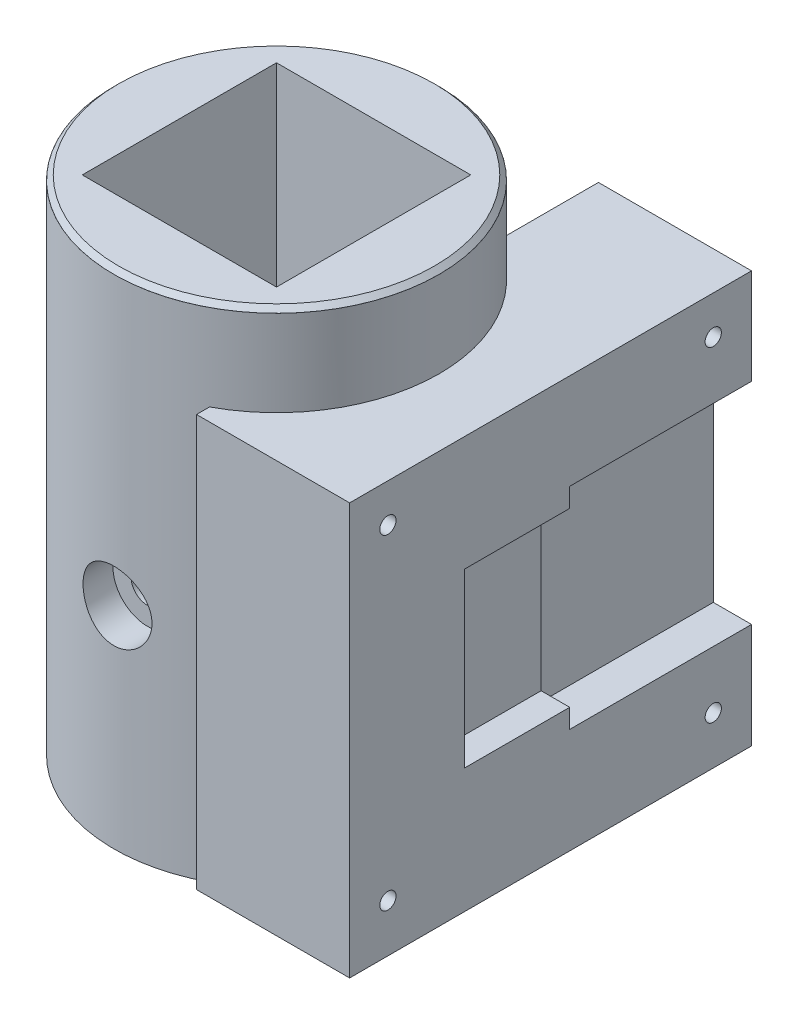
ISO-10303-21;
HEADER;
FILE_DESCRIPTION(('STEP AP214'),'2;1');
FILE_NAME('part.step','',(''),(''),'','','');
FILE_SCHEMA(('AUTOMOTIVE_DESIGN { 1 0 10303 214 1 1 1 1 }'));
ENDSEC;
DATA;
#1=APPLICATION_CONTEXT('core data for automotive mechanical design processes');
#2=APPLICATION_PROTOCOL_DEFINITION('international standard','automotive_design',2000,#1);
#3=PRODUCT_CONTEXT('',#1,'mechanical');
#4=PRODUCT('Part','Part','',(#3));
#5=PRODUCT_RELATED_PRODUCT_CATEGORY('part','',(#4));
#6=PRODUCT_DEFINITION_FORMATION('','',#4);
#7=PRODUCT_DEFINITION_CONTEXT('part definition',#1,'design');
#8=PRODUCT_DEFINITION('design','',#6,#7);
#9=PRODUCT_DEFINITION_SHAPE('','',#8);
#10=(LENGTH_UNIT() NAMED_UNIT(*) SI_UNIT(.MILLI.,.METRE.));
#11=(NAMED_UNIT(*) PLANE_ANGLE_UNIT() SI_UNIT($,.RADIAN.));
#12=(NAMED_UNIT(*) SI_UNIT($,.STERADIAN.) SOLID_ANGLE_UNIT());
#13=UNCERTAINTY_MEASURE_WITH_UNIT(LENGTH_MEASURE(1.E-05),#10,'distance_accuracy_value','');
#14=(GEOMETRIC_REPRESENTATION_CONTEXT(3) GLOBAL_UNCERTAINTY_ASSIGNED_CONTEXT((#13)) GLOBAL_UNIT_ASSIGNED_CONTEXT((#10,
#11,#12)) REPRESENTATION_CONTEXT('',''));
#15=CARTESIAN_POINT('',(0.,0.,0.));
#16=DIRECTION('',(0.,0.,1.));
#17=DIRECTION('',(1.,0.,0.));
#18=AXIS2_PLACEMENT_3D('',#15,#16,#17);
#19=CARTESIAN_POINT('',(0.,-95.,13.5));
#20=DIRECTION('',(0.,0.,1.));
#21=DIRECTION('',(1.,0.,0.));
#22=AXIS2_PLACEMENT_3D('',#19,#20,#21);
#23=PLANE('',#22);
#24=CARTESIAN_POINT('',(0.,-95.,13.5));
#25=DIRECTION('',(0.,0.,-1.));
#26=DIRECTION('',(1.,0.,0.));
#27=AXIS2_PLACEMENT_3D('',#24,#25,#26);
#28=CIRCLE('',#27,1.7);
#29=CARTESIAN_POINT('',(1.7,-95.,13.5));
#30=VERTEX_POINT('',#29);
#31=EDGE_CURVE('E318',#30,#30,#28,.T.);
#32=ORIENTED_EDGE('',*,*,#31,.T.);
#33=EDGE_LOOP('',(#32));
#34=FACE_BOUND('',#33,.T.);
#35=CARTESIAN_POINT('',(0.,-95.,13.5));
#36=DIRECTION('',(0.,0.,-1.));
#37=DIRECTION('',(1.,0.,0.));
#38=AXIS2_PLACEMENT_3D('',#35,#36,#37);
#39=CIRCLE('',#38,3.6);
#40=CARTESIAN_POINT('',(3.6,-95.,13.5));
#41=VERTEX_POINT('',#40);
#42=EDGE_CURVE('E314',#41,#41,#39,.T.);
#43=ORIENTED_EDGE('',*,*,#42,.F.);
#44=EDGE_LOOP('',(#43));
#45=FACE_BOUND('',#44,.T.);
#46=ADVANCED_FACE('F14',(#34,#45),#23,.T.);
#47=CARTESIAN_POINT('',(0.,-64.5,0.));
#48=DIRECTION('',(0.,-1.,0.));
#49=DIRECTION('',(1.,0.,0.));
#50=AXIS2_PLACEMENT_3D('',#47,#48,#49);
#51=CONICAL_SURFACE('',#50,16.5,0.775497496809);
#52=DIRECTION('',(0.700071410925818,-0.714072839144814,0.));
#53=VECTOR('',#52,1.);
#54=CARTESIAN_POINT('',(16.5,-64.5,0.));
#55=LINE('',#54,#53);
#56=CARTESIAN_POINT('',(16.5,-64.5,0.));
#57=VERTEX_POINT('',#56);
#58=CARTESIAN_POINT('',(16.995098039216,-65.005,0.));
#59=VERTEX_POINT('',#58);
#60=EDGE_CURVE('E9',#57,#59,#55,.T.);
#61=ORIENTED_EDGE('',*,*,#60,.F.);
#62=CARTESIAN_POINT('',(0.,-64.5,0.));
#63=DIRECTION('',(0.,1.,0.));
#64=DIRECTION('',(1.,0.,0.));
#65=AXIS2_PLACEMENT_3D('',#62,#63,#64);
#66=CIRCLE('',#65,16.5);
#67=EDGE_CURVE('E425',#57,#57,#66,.T.);
#68=ORIENTED_EDGE('',*,*,#67,.F.);
#69=ORIENTED_EDGE('',*,*,#60,.T.);
#70=CARTESIAN_POINT('',(0.,-65.005,0.));
#71=DIRECTION('',(0.,1.,0.));
#72=DIRECTION('',(1.,0.,0.));
#73=AXIS2_PLACEMENT_3D('',#70,#71,#72);
#74=CIRCLE('',#73,16.995098039216);
#75=EDGE_CURVE('E428',#59,#59,#74,.T.);
#76=ORIENTED_EDGE('',*,*,#75,.T.);
#77=EDGE_LOOP('',(#61,#68,#69,#76));
#78=FACE_BOUND('',#77,.T.);
#79=ADVANCED_FACE('F593',(#78),#51,.T.);
#80=CARTESIAN_POINT('',(18.99,-78.,12.36));
#81=DIRECTION('',(1.,0.,0.));
#82=DIRECTION('',(0.,1.,0.));
#83=AXIS2_PLACEMENT_3D('',#80,#81,#82);
#84=PLANE('',#83);
#85=CARTESIAN_POINT('',(18.99,-78.,12.36));
#86=DIRECTION('',(-1.,0.,0.));
#87=DIRECTION('',(0.,0.,-1.));
#88=AXIS2_PLACEMENT_3D('',#85,#86,#87);
#89=CIRCLE('',#88,0.85);
#90=CARTESIAN_POINT('',(18.99,-78.,11.51));
#91=VERTEX_POINT('',#90);
#92=EDGE_CURVE('E265',#91,#91,#89,.T.);
#93=ORIENTED_EDGE('',*,*,#92,.F.);
#94=EDGE_LOOP('',(#93));
#95=FACE_BOUND('',#94,.T.);
#96=ADVANCED_FACE('F16',(#95),#84,.T.);
#97=CARTESIAN_POINT('',(18.99,-78.,-21.64));
#98=DIRECTION('',(1.,0.,0.));
#99=DIRECTION('',(0.,1.,0.));
#100=AXIS2_PLACEMENT_3D('',#97,#98,#99);
#101=PLANE('',#100);
#102=CARTESIAN_POINT('',(18.99,-78.,-21.64));
#103=DIRECTION('',(-1.,0.,0.));
#104=DIRECTION('',(0.,0.,-1.));
#105=AXIS2_PLACEMENT_3D('',#102,#103,#104);
#106=CIRCLE('',#105,0.85);
#107=CARTESIAN_POINT('',(18.99,-78.,-22.49));
#108=VERTEX_POINT('',#107);
#109=EDGE_CURVE('E261',#108,#108,#106,.T.);
#110=ORIENTED_EDGE('',*,*,#109,.F.);
#111=EDGE_LOOP('',(#110));
#112=FACE_BOUND('',#111,.T.);
#113=ADVANCED_FACE('F592',(#112),#101,.T.);
#114=CARTESIAN_POINT('',(18.99,-112.,12.36));
#115=DIRECTION('',(1.,0.,0.));
#116=DIRECTION('',(0.,1.,0.));
#117=AXIS2_PLACEMENT_3D('',#114,#115,#116);
#118=PLANE('',#117);
#119=CARTESIAN_POINT('',(18.99,-112.,12.36));
#120=DIRECTION('',(-1.,0.,0.));
#121=DIRECTION('',(0.,0.,-1.));
#122=AXIS2_PLACEMENT_3D('',#119,#120,#121);
#123=CIRCLE('',#122,0.85);
#124=CARTESIAN_POINT('',(18.99,-112.,11.51));
#125=VERTEX_POINT('',#124);
#126=EDGE_CURVE('E262',#125,#125,#123,.T.);
#127=ORIENTED_EDGE('',*,*,#126,.F.);
#128=EDGE_LOOP('',(#127));
#129=FACE_BOUND('',#128,.T.);
#130=ADVANCED_FACE('F599',(#129),#118,.T.);
#131=CARTESIAN_POINT('',(18.99,-112.,-21.64));
#132=DIRECTION('',(1.,0.,0.));
#133=DIRECTION('',(0.,1.,0.));
#134=AXIS2_PLACEMENT_3D('',#131,#132,#133);
#135=PLANE('',#134);
#136=CARTESIAN_POINT('',(18.99,-112.,-21.64));
#137=DIRECTION('',(-1.,0.,0.));
#138=DIRECTION('',(0.,0.,-1.));
#139=AXIS2_PLACEMENT_3D('',#136,#137,#138);
#140=CIRCLE('',#139,0.85);
#141=CARTESIAN_POINT('',(18.99,-112.,-22.49));
#142=VERTEX_POINT('',#141);
#143=EDGE_CURVE('E337',#142,#142,#140,.T.);
#144=ORIENTED_EDGE('',*,*,#143,.F.);
#145=EDGE_LOOP('',(#144));
#146=FACE_BOUND('',#145,.T.);
#147=ADVANCED_FACE('F767',(#146),#135,.T.);
#148=CARTESIAN_POINT('',(21.01,-86.,4.36));
#149=DIRECTION('',(1.,0.,0.));
#150=DIRECTION('',(0.,1.,0.));
#151=AXIS2_PLACEMENT_3D('',#148,#149,#150);
#152=PLANE('',#151);
#153=DIRECTION('',(0.,1.,0.));
#154=VECTOR('',#153,1.);
#155=CARTESIAN_POINT('',(21.01,-85.,-6.64));
#156=LINE('',#155,#154);
#157=CARTESIAN_POINT('',(21.01,-104.,-6.64));
#158=VERTEX_POINT('',#157);
#159=CARTESIAN_POINT('',(21.01,-86.,-6.64));
#160=VERTEX_POINT('',#159);
#161=EDGE_CURVE('E386',#158,#160,#156,.T.);
#162=ORIENTED_EDGE('',*,*,#161,.T.);
#163=DIRECTION('',(0.,0.,-1.));
#164=VECTOR('',#163,1.);
#165=CARTESIAN_POINT('',(21.01,-86.,4.36));
#166=LINE('',#165,#164);
#167=CARTESIAN_POINT('',(21.01,-86.,4.36));
#168=VERTEX_POINT('',#167);
#169=EDGE_CURVE('E357',#168,#160,#166,.T.);
#170=ORIENTED_EDGE('',*,*,#169,.F.);
#171=DIRECTION('',(0.,-1.,0.));
#172=VECTOR('',#171,1.);
#173=CARTESIAN_POINT('',(21.01,-86.,4.36));
#174=LINE('',#173,#172);
#175=CARTESIAN_POINT('',(21.01,-104.,4.36));
#176=VERTEX_POINT('',#175);
#177=EDGE_CURVE('E391',#168,#176,#174,.T.);
#178=ORIENTED_EDGE('',*,*,#177,.T.);
#179=DIRECTION('',(0.,0.,-1.));
#180=VECTOR('',#179,1.);
#181=CARTESIAN_POINT('',(21.01,-104.,4.36));
#182=LINE('',#181,#180);
#183=EDGE_CURVE('E402',#176,#158,#182,.T.);
#184=ORIENTED_EDGE('',*,*,#183,.T.);
#185=EDGE_LOOP('',(#162,#170,#178,#184));
#186=FACE_BOUND('',#185,.T.);
#187=ADVANCED_FACE('F612',(#186),#152,.T.);
#188=CARTESIAN_POINT('',(0.,-95.,9.9));
#189=DIRECTION('',(0.,0.,1.));
#190=DIRECTION('',(1.,0.,0.));
#191=AXIS2_PLACEMENT_3D('',#188,#189,#190);
#192=CYLINDRICAL_SURFACE('',#191,1.7);
#193=ORIENTED_EDGE('',*,*,#31,.F.);
#194=DIRECTION('',(0.,0.,1.));
#195=VECTOR('',#194,1.);
#196=CARTESIAN_POINT('',(1.7,-95.,9.9));
#197=LINE('',#196,#195);
#198=CARTESIAN_POINT('',(1.7,-95.,10.15));
#199=VERTEX_POINT('',#198);
#200=EDGE_CURVE('E25',#199,#30,#197,.T.);
#201=ORIENTED_EDGE('',*,*,#200,.F.);
#202=CARTESIAN_POINT('',(0.,-95.,10.15));
#203=DIRECTION('',(0.,0.,-1.));
#204=DIRECTION('',(1.,0.,0.));
#205=AXIS2_PLACEMENT_3D('',#202,#203,#204);
#206=CIRCLE('',#205,1.7);
#207=EDGE_CURVE('E356',#199,#199,#206,.T.);
#208=ORIENTED_EDGE('',*,*,#207,.T.);
#209=ORIENTED_EDGE('',*,*,#200,.T.);
#210=EDGE_LOOP('',(#193,#201,#208,#209));
#211=FACE_BOUND('',#210,.T.);
#212=ADVANCED_FACE('F766',(#211),#192,.F.);
#213=CARTESIAN_POINT('',(0.,-64.5,0.));
#214=DIRECTION('',(0.,-1.,0.));
#215=DIRECTION('',(0.,0.,-1.));
#216=AXIS2_PLACEMENT_3D('',#213,#214,#215);
#217=PLANE('',#216);
#218=DIRECTION('',(1.,0.,0.));
#219=VECTOR('',#218,1.);
#220=CARTESIAN_POINT('',(-5.075,-64.5,10.15));
#221=LINE('',#220,#219);
#222=CARTESIAN_POINT('',(-10.15,-64.5,10.15));
#223=VERTEX_POINT('',#222);
#224=CARTESIAN_POINT('',(10.15,-64.5,10.15));
#225=VERTEX_POINT('',#224);
#226=EDGE_CURVE('E348',#223,#225,#221,.T.);
#227=ORIENTED_EDGE('',*,*,#226,.F.);
#228=DIRECTION('',(0.,0.,-1.));
#229=VECTOR('',#228,1.);
#230=CARTESIAN_POINT('',(-10.15,-64.5,-5.075));
#231=LINE('',#230,#229);
#232=CARTESIAN_POINT('',(-10.15,-64.5,-10.15));
#233=VERTEX_POINT('',#232);
#234=EDGE_CURVE('E283',#223,#233,#231,.T.);
#235=ORIENTED_EDGE('',*,*,#234,.T.);
#236=DIRECTION('',(1.,0.,0.));
#237=VECTOR('',#236,1.);
#238=CARTESIAN_POINT('',(-5.075,-64.5,-10.15));
#239=LINE('',#238,#237);
#240=CARTESIAN_POINT('',(10.15,-64.5,-10.15));
#241=VERTEX_POINT('',#240);
#242=EDGE_CURVE('E305',#233,#241,#239,.T.);
#243=ORIENTED_EDGE('',*,*,#242,.T.);
#244=DIRECTION('',(0.,0.,-1.));
#245=VECTOR('',#244,1.);
#246=CARTESIAN_POINT('',(10.15,-64.5,-5.075));
#247=LINE('',#246,#245);
#248=EDGE_CURVE('E347',#225,#241,#247,.T.);
#249=ORIENTED_EDGE('',*,*,#248,.F.);
#250=EDGE_LOOP('',(#227,#235,#243,#249));
#251=FACE_BOUND('',#250,.T.);
#252=ORIENTED_EDGE('',*,*,#67,.T.);
#253=EDGE_LOOP('',(#252));
#254=FACE_BOUND('',#253,.T.);
#255=ADVANCED_FACE('F815',(#251,#254),#217,.F.);
#256=CARTESIAN_POINT('',(0.,-95.,13.5));
#257=DIRECTION('',(0.,0.,1.));
#258=DIRECTION('',(1.,0.,0.));
#259=AXIS2_PLACEMENT_3D('',#256,#257,#258);
#260=CYLINDRICAL_SURFACE('',#259,3.6);
#261=CARTESIAN_POINT('',(3.6,-95.,16.614451540752));
#262=CARTESIAN_POINT('',(3.6,-95.26777315453,16.614451540752));
#263=CARTESIAN_POINT('',(3.577237685166,-95.53538564906,16.619383858414));
#264=CARTESIAN_POINT('',(3.531758745326,-95.80169837244,16.629237646499));
#265=CARTESIAN_POINT('',(3.46335241105,-96.06551744181,16.643877350871));
#266=CARTESIAN_POINT('',(3.371579484551,-96.3255142693,16.663033406981));
#267=CARTESIAN_POINT('',(3.25580451209,-96.58012023311,16.686277744104));
#268=CARTESIAN_POINT('',(3.115232097871,-96.82739595312,16.712984097339));
#269=CARTESIAN_POINT('',(2.805467130443,-97.26978617391,16.767545420989));
#270=CARTESIAN_POINT('',(2.642342903132,-97.46811824163,16.794828845275));
#271=CARTESIAN_POINT('',(2.459003642037,-97.65783676193,16.823538731738));
#272=CARTESIAN_POINT('',(2.255004505603,-97.83660695542,16.852911026028));
#273=CARTESIAN_POINT('',(2.030072425646,-98.00176641541,16.881994023457));
#274=CARTESIAN_POINT('',(1.784176317768,-98.15027965778,16.909644603203));
#275=CARTESIAN_POINT('',(1.517634577381,-98.27866616825,16.934557005118));
#276=CARTESIAN_POINT('',(1.001694777047,-98.46645289824,16.972023787808));
#277=CARTESIAN_POINT('',(0.758955768616,-98.53463863698,16.986079389493));
#278=CARTESIAN_POINT('',(0.506182533207,-98.58425532436,16.996591502892));
#279=CARTESIAN_POINT('',(0.246908233122,-98.61315608247,17.002814078562));
#280=CARTESIAN_POINT('',(-0.01508473760298,-98.62022233257,17.004325997724));
#281=CARTESIAN_POINT('',(-0.275924309234,-98.60535921806,17.001098135983));
#282=CARTESIAN_POINT('',(-0.531810960402,-98.56950660007,16.993484005896));
#283=CARTESIAN_POINT('',(-1.074764340282,-98.44913673369,16.968571952306));
#284=CARTESIAN_POINT('',(-1.355399593153,-98.35711588245,16.949803388304));
#285=CARTESIAN_POINT('',(-1.619252975594,-98.24206069226,16.926937630625));
#286=CARTESIAN_POINT('',(-1.864993899809,-98.10724924621,16.901185134546));
#287=CARTESIAN_POINT('',(-2.091716181409,-97.95583186984,16.873745067377));
#288=CARTESIAN_POINT('',(-2.298886618723,-97.79086527956,16.845720094212));
#289=CARTESIAN_POINT('',(-2.486322553434,-97.61532909955,16.818058348424));
#290=CARTESIAN_POINT('',(-2.838424769957,-97.23107695742,16.762402338714));
#291=CARTESIAN_POINT('',(-3.000500569843,-97.01926082443,16.734415422552));
#292=CARTESIAN_POINT('',(-3.141161001074,-96.79902346332,16.708426875864));
#293=CARTESIAN_POINT('',(-3.261131996144,-96.57221659196,16.685093540011));
#294=CARTESIAN_POINT('',(-3.361071300027,-96.34031687102,16.664903604312));
#295=CARTESIAN_POINT('',(-3.441519959156,-96.10452499187,16.648210123126));
#296=CARTESIAN_POINT('',(-3.502864230518,-95.86584351219,16.635258505974));
#297=CARTESIAN_POINT('',(-3.592869286086,-95.35539947687,16.61606617806));
#298=CARTESIAN_POINT('',(-3.616652385529,-95.08337312239,16.610832267228));
#299=CARTESIAN_POINT('',(-3.616993046287,-94.81041949712,16.610718360823));
#300=CARTESIAN_POINT('',(-3.593983753542,-94.5378148131,16.615785594507));
#301=CARTESIAN_POINT('',(-3.547492638832,-94.26683467516,16.625955478273));
#302=CARTESIAN_POINT('',(-3.477177646036,-93.99885421986,16.641004330646));
#303=CARTESIAN_POINT('',(-3.38249586508,-93.73546009191,16.660540795794));
#304=CARTESIAN_POINT('',(-3.081149641833,-93.08922103068,16.71947191069));
#305=CARTESIAN_POINT('',(-2.836340785795,-92.70286119051,16.765003428681));
#306=CARTESIAN_POINT('',(-2.522906906532,-92.33511425735,16.818764155577));
#307=CARTESIAN_POINT('',(-2.139159991293,-92.0026874243,16.876555251895));
#308=CARTESIAN_POINT('',(-1.686844680358,-91.72320923094,16.931562084624));
#309=CARTESIAN_POINT('',(-1.171659153328,-91.51557075228,16.975524999097));
#310=CARTESIAN_POINT('',(-0.603366424343,-91.4,17.));
#311=CARTESIAN_POINT('',(0.388638517101,-91.4,17.));
#312=CARTESIAN_POINT('',(0.768110817666,-91.44794859422,16.989845789984));
#313=CARTESIAN_POINT('',(1.131691661206,-91.53989110451,16.970377216285));
#314=CARTESIAN_POINT('',(1.47354520073,-91.67092090007,16.943350354724));
#315=CARTESIAN_POINT('',(1.788823197178,-91.83517736016,16.911163892741));
#316=CARTESIAN_POINT('',(2.073844907245,-92.02584331245,16.876431056992));
#317=CARTESIAN_POINT('',(2.326321069318,-92.23515224477,16.841538213515));
#318=CARTESIAN_POINT('',(2.817967682385,-92.72679885784,16.767079426699));
#319=CARTESIAN_POINT('',(3.046776654847,-93.02222619612,16.727266276983));
#320=CARTESIAN_POINT('',(3.233937363282,-93.33383842525,16.691440195177));
#321=CARTESIAN_POINT('',(3.381425818088,-93.65678212672,16.661343288464));
#322=CARTESIAN_POINT('',(3.49090840415,-93.98744019132,16.63808979743));
#323=CARTESIAN_POINT('',(3.563570229327,-94.32301701756,16.622344948903));
#324=CARTESIAN_POINT('',(3.6,-94.66124763133,16.614451540752));
#325=CARTESIAN_POINT('',(3.6,-95.,16.614451540752));
#326=(BOUNDED_CURVE() B_SPLINE_CURVE(8,(#261,#262,#263,#264,#265,#266,#267,#268,#269,#270,#271,
#272,#273,#274,#275,#276,#277,#278,#279,#280,#281,#282,#283,#284,#285,#286,#287,#288,#289,#290,
#291,#292,#293,#294,#295,#296,#297,#298,#299,#300,#301,#302,#303,#304,#305,#306,#307,#308,#309,
#310,#311,#312,#313,#314,#315,#316,#317,#318,#319,#320,#321,#322,#323,#324,#325),.UNSPECIFIED.,
.T.,.F.) B_SPLINE_CURVE_WITH_KNOTS((9,7,7,7,7,7,7,7,7,9),(0.,0.110248942133,0.20537819821,
0.281643746127,0.37277263103,0.47277713802,0.584839801916,0.754689416079,0.864092424791,1.),
.UNSPECIFIED.) CURVE() GEOMETRIC_REPRESENTATION_ITEM() RATIONAL_B_SPLINE_CURVE((1.,1.,1.,1.,1.,
1.,1.,1.,1.,1.,1.,1.,1.,1.,1.,1.,1.,1.,1.,1.,1.,1.,1.,1.,1.,1.,1.,1.,1.,1.,1.,1.,1.,1.,1.,1.,1.,
1.,1.,1.,1.,1.,1.,1.,1.,1.,1.,1.,1.,1.,1.,1.,1.,1.,1.,1.,1.,1.,1.,1.,1.,1.,1.,1.,1.)) REPRESENTATION_ITEM(''));
#327=CARTESIAN_POINT('',(3.6,-95.,16.614451540752));
#328=VERTEX_POINT('',#327);
#329=EDGE_CURVE('E274',#328,#328,#326,.T.);
#330=ORIENTED_EDGE('',*,*,#329,.F.);
#331=DIRECTION('',(0.,0.,1.));
#332=VECTOR('',#331,1.);
#333=CARTESIAN_POINT('',(3.6,-95.,13.5));
#334=LINE('',#333,#332);
#335=EDGE_CURVE('E311',#41,#328,#334,.T.);
#336=ORIENTED_EDGE('',*,*,#335,.F.);
#337=ORIENTED_EDGE('',*,*,#42,.T.);
#338=ORIENTED_EDGE('',*,*,#335,.T.);
#339=EDGE_LOOP('',(#330,#336,#337,#338));
#340=FACE_BOUND('',#339,.T.);
#341=ADVANCED_FACE('F841',(#340),#260,.F.);
#342=CARTESIAN_POINT('',(0.,-95.,-17.11));
#343=DIRECTION('',(0.,0.,1.));
#344=DIRECTION('',(1.,0.,0.));
#345=AXIS2_PLACEMENT_3D('',#342,#343,#344);
#346=CYLINDRICAL_SURFACE('',#345,1.4);
#347=CARTESIAN_POINT('',(0.,-95.,-10.15));
#348=DIRECTION('',(0.,0.,-1.));
#349=DIRECTION('',(1.,0.,0.));
#350=AXIS2_PLACEMENT_3D('',#347,#348,#349);
#351=CIRCLE('',#350,1.4);
#352=CARTESIAN_POINT('',(1.4,-95.,-10.15));
#353=VERTEX_POINT('',#352);
#354=EDGE_CURVE('E286',#353,#353,#351,.T.);
#355=ORIENTED_EDGE('',*,*,#354,.F.);
#356=DIRECTION('',(0.,0.,1.));
#357=VECTOR('',#356,1.);
#358=CARTESIAN_POINT('',(1.4,-95.,-17.11));
#359=LINE('',#358,#357);
#360=CARTESIAN_POINT('',(1.4,-95.,-16.94225486763));
#361=VERTEX_POINT('',#360);
#362=EDGE_CURVE('E315',#361,#353,#359,.T.);
#363=ORIENTED_EDGE('',*,*,#362,.F.);
#364=CARTESIAN_POINT('',(1.4,-95.,-16.94225486763));
#365=CARTESIAN_POINT('',(1.4,-95.16791128115,-16.94225486763));
#366=CARTESIAN_POINT('',(1.376505536397,-95.33584013108,-16.94419621495));
#367=CARTESIAN_POINT('',(1.329502754113,-95.50151977948,-16.94808066817));
#368=CARTESIAN_POINT('',(1.258419130172,-95.66242535125,-16.95374676344));
#369=CARTESIAN_POINT('',(1.162397673546,-95.81538346864,-16.96085611902));
#370=CARTESIAN_POINT('',(1.040517657906,-95.95617965038,-16.96877498145));
#371=CARTESIAN_POINT('',(0.760974713983,-96.18743768558,-16.98346949617));
#372=CARTESIAN_POINT('',(0.6049811387,-96.28502531644,-16.99047866886));
#373=CARTESIAN_POINT('',(0.427589423844,-96.3609812301,-16.99662731264));
#374=CARTESIAN_POINT('',(0.235154109313,-96.4081026724,-17.00071683476));
#375=CARTESIAN_POINT('',(0.03597888792392,-96.4225575192,-17.00189978607));
#376=CARTESIAN_POINT('',(-0.16110552161,-96.40404535262,-17.00026621137));
#377=CARTESIAN_POINT('',(-0.53823503293,-96.3072149519,-16.99254084903));
#378=CARTESIAN_POINT('',(-0.712041443016,-96.2294588296,-16.98649961136));
#379=CARTESIAN_POINT('',(-0.866305775703,-96.12878284249,-16.97914001269));
#380=CARTESIAN_POINT('',(-0.999300080736,-96.01046255227,-16.97141595685));
#381=CARTESIAN_POINT('',(-1.110229526172,-95.87932998972,-16.96411749164));
#382=CARTESIAN_POINT('',(-1.199112898351,-95.73984389765,-16.95779259364));
#383=CARTESIAN_POINT('',(-1.34788541029,-95.42368621658,-16.94667587896));
#384=CARTESIAN_POINT('',(-1.400350344835,-95.2411379869,-16.9423000859));
#385=CARTESIAN_POINT('',(-1.424032684033,-95.05275102187,-16.94019809591));
#386=CARTESIAN_POINT('',(-1.418554410297,-94.86250226967,-16.94067619865));
#387=CARTESIAN_POINT('',(-1.383634783293,-94.67466694204,-16.94373565308));
#388=CARTESIAN_POINT('',(-1.31941872663,-94.49396430336,-16.94897495121));
#389=CARTESIAN_POINT('',(-1.155461574155,-94.19572735017,-16.96083808588));
#390=CARTESIAN_POINT('',(-1.065728758791,-94.07046567122,-16.96697839062));
#391=CARTESIAN_POINT('',(-0.957112780437,-93.95329751785,-16.97380696771));
#392=CARTESIAN_POINT('',(-0.82978604186,-93.8479739171,-16.98084435691));
#393=CARTESIAN_POINT('',(-0.684601221817,-93.75844816611,-16.98743972573));
#394=CARTESIAN_POINT('',(-0.523157504623,-93.6889137968,-16.99284970677));
#395=CARTESIAN_POINT('',(-0.175050414726,-93.59953508738,-16.99998055525));
#396=CARTESIAN_POINT('',(0.007247609345876,-93.58021250183,-17.00165642772));
#397=CARTESIAN_POINT('',(0.192202580051,-93.58915836129,-17.00094049615));
#398=CARTESIAN_POINT('',(0.372470397267,-93.62648789319,-16.99771183879));
#399=CARTESIAN_POINT('',(0.541055384449,-93.6894449741,-16.99255565762));
#400=CARTESIAN_POINT('',(0.692302794057,-93.77249225364,-16.98640080651));
#401=CARTESIAN_POINT('',(0.991337391369,-93.98975360593,-16.97190879609));
#402=CARTESIAN_POINT('',(1.130110135155,-94.13522629552,-16.96322937737));
#403=CARTESIAN_POINT('',(1.239332626935,-94.29584637056,-16.95526438205));
#404=CARTESIAN_POINT('',(1.32006553555,-94.46623490605,-16.94886082491));
#405=CARTESIAN_POINT('',(1.373369477082,-94.64239872251,-16.94445528105));
#406=CARTESIAN_POINT('',(1.4,-94.82123219572,-16.94225486763));
#407=CARTESIAN_POINT('',(1.4,-95.,-16.94225486763));
#408=(BOUNDED_CURVE() B_SPLINE_CURVE(7,(#364,#365,#366,#367,#368,#369,#370,#371,#372,#373,#374,
#375,#376,#377,#378,#379,#380,#381,#382,#383,#384,#385,#386,#387,#388,#389,#390,#391,#392,#393,
#394,#395,#396,#397,#398,#399,#400,#401,#402,#403,#404,#405,#406,#407),.UNSPECIFIED.,.T.,
.F.) B_SPLINE_CURVE_WITH_KNOTS((8,6,6,6,6,6,6,8),(0.,0.151722028976,0.286333085443,
0.423109364512,0.587147012571,0.713587033249,0.838671382319,1.),
.UNSPECIFIED.) CURVE() GEOMETRIC_REPRESENTATION_ITEM() RATIONAL_B_SPLINE_CURVE((1.,1.,1.,1.,1.,
1.,1.,1.,1.,1.,1.,1.,1.,1.,1.,1.,1.,1.,1.,1.,1.,1.,1.,1.,1.,1.,1.,1.,1.,1.,1.,1.,1.,1.,1.,1.,1.,
1.,1.,1.,1.,1.,1.,1.)) REPRESENTATION_ITEM(''));
#409=EDGE_CURVE('E234',#361,#361,#408,.T.);
#410=ORIENTED_EDGE('',*,*,#409,.T.);
#411=ORIENTED_EDGE('',*,*,#362,.T.);
#412=EDGE_LOOP('',(#355,#363,#410,#411));
#413=FACE_BOUND('',#412,.T.);
#414=ADVANCED_FACE('F797',(#413),#346,.F.);
#415=CARTESIAN_POINT('',(0.,-65.005,0.));
#416=DIRECTION('',(0.,-1.,0.));
#417=DIRECTION('',(0.,0.,-1.));
#418=AXIS2_PLACEMENT_3D('',#415,#416,#417);
#419=PLANE('',#418);
#420=ORIENTED_EDGE('',*,*,#75,.F.);
#421=EDGE_LOOP('',(#420));
#422=FACE_BOUND('',#421,.T.);
#423=CARTESIAN_POINT('',(0.,-65.005,0.));
#424=DIRECTION('',(0.,1.,0.));
#425=DIRECTION('',(1.,0.,0.));
#426=AXIS2_PLACEMENT_3D('',#423,#424,#425);
#427=CIRCLE('',#426,17.);
#428=CARTESIAN_POINT('',(17.,-65.005,0.));
#429=VERTEX_POINT('',#428);
#430=EDGE_CURVE('E235',#429,#429,#427,.T.);
#431=ORIENTED_EDGE('',*,*,#430,.T.);
#432=EDGE_LOOP('',(#431));
#433=FACE_BOUND('',#432,.T.);
#434=ADVANCED_FACE('F793',(#422,#433),#419,.F.);
#435=CARTESIAN_POINT('',(20.01,-84.,-36.64));
#436=DIRECTION('',(1.,0.,0.));
#437=DIRECTION('',(0.,1.,0.));
#438=AXIS2_PLACEMENT_3D('',#435,#436,#437);
#439=PLANE('',#438);
#440=DIRECTION('',(0.,-1.,0.));
#441=VECTOR('',#440,1.);
#442=CARTESIAN_POINT('',(20.01,-84.,-6.64));
#443=LINE('',#442,#441);
#444=CARTESIAN_POINT('',(20.01,-84.,-6.64));
#445=VERTEX_POINT('',#444);
#446=CARTESIAN_POINT('',(20.01,-106.,-6.64));
#447=VERTEX_POINT('',#446);
#448=EDGE_CURVE('E333',#445,#447,#443,.T.);
#449=ORIENTED_EDGE('',*,*,#448,.T.);
#450=DIRECTION('',(0.,0.,1.));
#451=VECTOR('',#450,1.);
#452=CARTESIAN_POINT('',(20.01,-106.,-36.64));
#453=LINE('',#452,#451);
#454=CARTESIAN_POINT('',(20.01,-106.,-25.64));
#455=VERTEX_POINT('',#454);
#456=EDGE_CURVE('E285',#455,#447,#453,.T.);
#457=ORIENTED_EDGE('',*,*,#456,.F.);
#458=DIRECTION('',(0.,-1.,0.));
#459=VECTOR('',#458,1.);
#460=CARTESIAN_POINT('',(20.01,-79.,-25.64));
#461=LINE('',#460,#459);
#462=CARTESIAN_POINT('',(20.01,-84.,-25.64));
#463=VERTEX_POINT('',#462);
#464=EDGE_CURVE('E281',#463,#455,#461,.T.);
#465=ORIENTED_EDGE('',*,*,#464,.F.);
#466=DIRECTION('',(0.,0.,1.));
#467=VECTOR('',#466,1.);
#468=CARTESIAN_POINT('',(20.01,-84.,-36.64));
#469=LINE('',#468,#467);
#470=EDGE_CURVE('E361',#463,#445,#469,.T.);
#471=ORIENTED_EDGE('',*,*,#470,.T.);
#472=EDGE_LOOP('',(#449,#457,#465,#471));
#473=FACE_BOUND('',#472,.T.);
#474=ADVANCED_FACE('F637',(#473),#439,.T.);
#475=CARTESIAN_POINT('',(18.99,-78.,12.36));
#476=DIRECTION('',(1.,0.,0.));
#477=DIRECTION('',(0.,0.,-1.));
#478=AXIS2_PLACEMENT_3D('',#475,#476,#477);
#479=CYLINDRICAL_SURFACE('',#478,0.85);
#480=CARTESIAN_POINT('',(24.,-78.,12.36));
#481=DIRECTION('',(-1.,0.,0.));
#482=DIRECTION('',(0.,0.,-1.));
#483=AXIS2_PLACEMENT_3D('',#480,#481,#482);
#484=CIRCLE('',#483,0.85);
#485=CARTESIAN_POINT('',(24.,-78.,11.51));
#486=VERTEX_POINT('',#485);
#487=EDGE_CURVE('E421',#486,#486,#484,.T.);
#488=ORIENTED_EDGE('',*,*,#487,.F.);
#489=DIRECTION('',(1.,0.,0.));
#490=VECTOR('',#489,1.);
#491=CARTESIAN_POINT('',(18.99,-78.,11.51));
#492=LINE('',#491,#490);
#493=EDGE_CURVE('E263',#91,#486,#492,.T.);
#494=ORIENTED_EDGE('',*,*,#493,.F.);
#495=ORIENTED_EDGE('',*,*,#92,.T.);
#496=ORIENTED_EDGE('',*,*,#493,.T.);
#497=EDGE_LOOP('',(#488,#494,#495,#496));
#498=FACE_BOUND('',#497,.T.);
#499=ADVANCED_FACE('F589',(#498),#479,.F.);
#500=CARTESIAN_POINT('',(18.99,-78.,-21.64));
#501=DIRECTION('',(1.,0.,0.));
#502=DIRECTION('',(0.,0.,-1.));
#503=AXIS2_PLACEMENT_3D('',#500,#501,#502);
#504=CYLINDRICAL_SURFACE('',#503,0.85);
#505=CARTESIAN_POINT('',(24.,-78.,-21.64));
#506=DIRECTION('',(-1.,0.,0.));
#507=DIRECTION('',(0.,0.,-1.));
#508=AXIS2_PLACEMENT_3D('',#505,#506,#507);
#509=CIRCLE('',#508,0.85);
#510=CARTESIAN_POINT('',(24.,-78.,-22.49));
#511=VERTEX_POINT('',#510);
#512=EDGE_CURVE('E482',#511,#511,#509,.T.);
#513=ORIENTED_EDGE('',*,*,#512,.F.);
#514=DIRECTION('',(1.,0.,0.));
#515=VECTOR('',#514,1.);
#516=CARTESIAN_POINT('',(18.99,-78.,-22.49));
#517=LINE('',#516,#515);
#518=EDGE_CURVE('E258',#108,#511,#517,.T.);
#519=ORIENTED_EDGE('',*,*,#518,.F.);
#520=ORIENTED_EDGE('',*,*,#109,.T.);
#521=ORIENTED_EDGE('',*,*,#518,.T.);
#522=EDGE_LOOP('',(#513,#519,#520,#521));
#523=FACE_BOUND('',#522,.T.);
#524=ADVANCED_FACE('F820',(#523),#504,.F.);
#525=CARTESIAN_POINT('',(18.99,-112.,12.36));
#526=DIRECTION('',(1.,0.,0.));
#527=DIRECTION('',(0.,0.,-1.));
#528=AXIS2_PLACEMENT_3D('',#525,#526,#527);
#529=CYLINDRICAL_SURFACE('',#528,0.85);
#530=CARTESIAN_POINT('',(24.,-112.,12.36));
#531=DIRECTION('',(-1.,0.,0.));
#532=DIRECTION('',(0.,0.,-1.));
#533=AXIS2_PLACEMENT_3D('',#530,#531,#532);
#534=CIRCLE('',#533,0.85);
#535=CARTESIAN_POINT('',(24.,-112.,11.51));
#536=VERTEX_POINT('',#535);
#537=EDGE_CURVE('E453',#536,#536,#534,.T.);
#538=ORIENTED_EDGE('',*,*,#537,.F.);
#539=DIRECTION('',(1.,0.,0.));
#540=VECTOR('',#539,1.);
#541=CARTESIAN_POINT('',(18.99,-112.,11.51));
#542=LINE('',#541,#540);
#543=EDGE_CURVE('E340',#125,#536,#542,.T.);
#544=ORIENTED_EDGE('',*,*,#543,.F.);
#545=ORIENTED_EDGE('',*,*,#126,.T.);
#546=ORIENTED_EDGE('',*,*,#543,.T.);
#547=EDGE_LOOP('',(#538,#544,#545,#546));
#548=FACE_BOUND('',#547,.T.);
#549=ADVANCED_FACE('F824',(#548),#529,.F.);
#550=CARTESIAN_POINT('',(18.99,-112.,-21.64));
#551=DIRECTION('',(1.,0.,0.));
#552=DIRECTION('',(0.,0.,-1.));
#553=AXIS2_PLACEMENT_3D('',#550,#551,#552);
#554=CYLINDRICAL_SURFACE('',#553,0.85);
#555=CARTESIAN_POINT('',(24.,-112.,-21.64));
#556=DIRECTION('',(-1.,0.,0.));
#557=DIRECTION('',(0.,0.,-1.));
#558=AXIS2_PLACEMENT_3D('',#555,#556,#557);
#559=CIRCLE('',#558,0.85);
#560=CARTESIAN_POINT('',(24.,-112.,-22.49));
#561=VERTEX_POINT('',#560);
#562=EDGE_CURVE('E449',#561,#561,#559,.T.);
#563=ORIENTED_EDGE('',*,*,#562,.F.);
#564=DIRECTION('',(1.,0.,0.));
#565=VECTOR('',#564,1.);
#566=CARTESIAN_POINT('',(18.99,-112.,-22.49));
#567=LINE('',#566,#565);
#568=EDGE_CURVE('E341',#142,#561,#567,.T.);
#569=ORIENTED_EDGE('',*,*,#568,.F.);
#570=ORIENTED_EDGE('',*,*,#143,.T.);
#571=ORIENTED_EDGE('',*,*,#568,.T.);
#572=EDGE_LOOP('',(#563,#569,#570,#571));
#573=FACE_BOUND('',#572,.T.);
#574=ADVANCED_FACE('F923',(#573),#554,.F.);
#575=CARTESIAN_POINT('',(8.,-74.,-25.64));
#576=DIRECTION('',(0.,-1.,0.));
#577=DIRECTION('',(0.,0.,-1.));
#578=AXIS2_PLACEMENT_3D('',#575,#576,#577);
#579=PLANE('',#578);
#580=DIRECTION('',(0.,0.,1.));
#581=VECTOR('',#580,1.);
#582=CARTESIAN_POINT('',(24.,-74.,-25.64));
#583=LINE('',#582,#581);
#584=CARTESIAN_POINT('',(24.,-74.,-25.64));
#585=VERTEX_POINT('',#584);
#586=CARTESIAN_POINT('',(24.,-74.,16.36));
#587=VERTEX_POINT('',#586);
#588=EDGE_CURVE('E412',#585,#587,#583,.T.);
#589=ORIENTED_EDGE('',*,*,#588,.F.);
#590=DIRECTION('',(1.,0.,0.));
#591=VECTOR('',#590,1.);
#592=CARTESIAN_POINT('',(8.,-74.,-25.64));
#593=LINE('',#592,#591);
#594=CARTESIAN_POINT('',(8.,-74.,-25.64));
#595=VERTEX_POINT('',#594);
#596=EDGE_CURVE('E282',#595,#585,#593,.T.);
#597=ORIENTED_EDGE('',*,*,#596,.F.);
#598=DIRECTION('',(0.,0.,1.));
#599=VECTOR('',#598,1.);
#600=CARTESIAN_POINT('',(8.,-74.,-25.64));
#601=LINE('',#600,#599);
#602=CARTESIAN_POINT('',(8.,-74.,-15.));
#603=VERTEX_POINT('',#602);
#604=EDGE_CURVE('E230',#595,#603,#601,.T.);
#605=ORIENTED_EDGE('',*,*,#604,.T.);
#606=CARTESIAN_POINT('',(0.,-74.,0.));
#607=DIRECTION('',(0.,1.,0.));
#608=DIRECTION('',(1.,0.,0.));
#609=AXIS2_PLACEMENT_3D('',#606,#607,#608);
#610=CIRCLE('',#609,17.);
#611=CARTESIAN_POINT('',(17.,-74.,0.));
#612=VERTEX_POINT('',#611);
#613=EDGE_CURVE('E222',#612,#603,#610,.T.);
#614=ORIENTED_EDGE('',*,*,#613,.F.);
#615=CARTESIAN_POINT('',(0.,-74.,0.));
#616=DIRECTION('',(0.,1.,0.));
#617=DIRECTION('',(1.,0.,0.));
#618=AXIS2_PLACEMENT_3D('',#615,#616,#617);
#619=CIRCLE('',#618,17.);
#620=CARTESIAN_POINT('',(8.,-74.,15.));
#621=VERTEX_POINT('',#620);
#622=EDGE_CURVE('E227',#621,#612,#619,.T.);
#623=ORIENTED_EDGE('',*,*,#622,.F.);
#624=DIRECTION('',(0.,0.,1.));
#625=VECTOR('',#624,1.);
#626=CARTESIAN_POINT('',(8.,-74.,-25.64));
#627=LINE('',#626,#625);
#628=CARTESIAN_POINT('',(8.,-74.,16.36));
#629=VERTEX_POINT('',#628);
#630=EDGE_CURVE('E344',#621,#629,#627,.T.);
#631=ORIENTED_EDGE('',*,*,#630,.T.);
#632=DIRECTION('',(1.,0.,0.));
#633=VECTOR('',#632,1.);
#634=CARTESIAN_POINT('',(8.,-74.,16.36));
#635=LINE('',#634,#633);
#636=EDGE_CURVE('E418',#629,#587,#635,.T.);
#637=ORIENTED_EDGE('',*,*,#636,.T.);
#638=EDGE_LOOP('',(#589,#597,#605,#614,#623,#631,#637));
#639=FACE_BOUND('',#638,.T.);
#640=ADVANCED_FACE('F225',(#639),#579,.F.);
#641=CARTESIAN_POINT('',(20.01,-84.,-36.64));
#642=DIRECTION('',(0.,-1.,0.));
#643=DIRECTION('',(0.,0.,-1.));
#644=AXIS2_PLACEMENT_3D('',#641,#642,#643);
#645=PLANE('',#644);
#646=DIRECTION('',(0.,0.,1.));
#647=VECTOR('',#646,1.);
#648=CARTESIAN_POINT('',(24.,-84.,-31.14));
#649=LINE('',#648,#647);
#650=CARTESIAN_POINT('',(24.,-84.,-25.64));
#651=VERTEX_POINT('',#650);
#652=CARTESIAN_POINT('',(24.,-84.,-6.64));
#653=VERTEX_POINT('',#652);
#654=EDGE_CURVE('E331',#651,#653,#649,.T.);
#655=ORIENTED_EDGE('',*,*,#654,.T.);
#656=DIRECTION('',(1.,0.,0.));
#657=VECTOR('',#656,1.);
#658=CARTESIAN_POINT('',(20.01,-84.,-6.64));
#659=LINE('',#658,#657);
#660=EDGE_CURVE('E336',#445,#653,#659,.T.);
#661=ORIENTED_EDGE('',*,*,#660,.F.);
#662=ORIENTED_EDGE('',*,*,#470,.F.);
#663=DIRECTION('',(-1.,0.,0.));
#664=VECTOR('',#663,1.);
#665=CARTESIAN_POINT('',(14.005,-84.,-25.64));
#666=LINE('',#665,#664);
#667=EDGE_CURVE('E275',#651,#463,#666,.T.);
#668=ORIENTED_EDGE('',*,*,#667,.F.);
#669=EDGE_LOOP('',(#655,#661,#662,#668));
#670=FACE_BOUND('',#669,.T.);
#671=ADVANCED_FACE('F529',(#670),#645,.T.);
#672=CARTESIAN_POINT('',(21.01,-86.,4.36));
#673=DIRECTION('',(0.,-1.,0.));
#674=DIRECTION('',(0.,0.,-1.));
#675=AXIS2_PLACEMENT_3D('',#672,#673,#674);
#676=PLANE('',#675);
#677=DIRECTION('',(0.,0.,1.));
#678=VECTOR('',#677,1.);
#679=CARTESIAN_POINT('',(24.,-86.,-10.64));
#680=LINE('',#679,#678);
#681=CARTESIAN_POINT('',(24.,-86.,-6.64));
#682=VERTEX_POINT('',#681);
#683=CARTESIAN_POINT('',(24.,-86.,4.36));
#684=VERTEX_POINT('',#683);
#685=EDGE_CURVE('E332',#682,#684,#680,.T.);
#686=ORIENTED_EDGE('',*,*,#685,.T.);
#687=DIRECTION('',(1.,0.,0.));
#688=VECTOR('',#687,1.);
#689=CARTESIAN_POINT('',(21.01,-86.,4.36));
#690=LINE('',#689,#688);
#691=EDGE_CURVE('E362',#168,#684,#690,.T.);
#692=ORIENTED_EDGE('',*,*,#691,.F.);
#693=ORIENTED_EDGE('',*,*,#169,.T.);
#694=DIRECTION('',(1.,0.,0.));
#695=VECTOR('',#694,1.);
#696=CARTESIAN_POINT('',(20.51,-86.,-6.64));
#697=LINE('',#696,#695);
#698=EDGE_CURVE('E385',#160,#682,#697,.T.);
#699=ORIENTED_EDGE('',*,*,#698,.T.);
#700=EDGE_LOOP('',(#686,#692,#693,#699));
#701=FACE_BOUND('',#700,.T.);
#702=ADVANCED_FACE('F806',(#701),#676,.T.);
#703=CARTESIAN_POINT('',(21.01,-86.,4.36));
#704=DIRECTION('',(0.,0.,-1.));
#705=DIRECTION('',(0.,-1.,0.));
#706=AXIS2_PLACEMENT_3D('',#703,#704,#705);
#707=PLANE('',#706);
#708=DIRECTION('',(0.,-1.,0.));
#709=VECTOR('',#708,1.);
#710=CARTESIAN_POINT('',(24.,-80.,4.36));
#711=LINE('',#710,#709);
#712=CARTESIAN_POINT('',(24.,-104.,4.36));
#713=VERTEX_POINT('',#712);
#714=EDGE_CURVE('E375',#684,#713,#711,.T.);
#715=ORIENTED_EDGE('',*,*,#714,.T.);
#716=DIRECTION('',(1.,0.,0.));
#717=VECTOR('',#716,1.);
#718=CARTESIAN_POINT('',(21.01,-104.,4.36));
#719=LINE('',#718,#717);
#720=EDGE_CURVE('E394',#176,#713,#719,.T.);
#721=ORIENTED_EDGE('',*,*,#720,.F.);
#722=ORIENTED_EDGE('',*,*,#177,.F.);
#723=ORIENTED_EDGE('',*,*,#691,.T.);
#724=EDGE_LOOP('',(#715,#721,#722,#723));
#725=FACE_BOUND('',#724,.T.);
#726=ADVANCED_FACE('F780',(#725),#707,.T.);
#727=CARTESIAN_POINT('',(21.01,-104.,4.36));
#728=DIRECTION('',(0.,-1.,0.));
#729=DIRECTION('',(0.,0.,-1.));
#730=AXIS2_PLACEMENT_3D('',#727,#728,#729);
#731=PLANE('',#730);
#732=DIRECTION('',(1.,0.,0.));
#733=VECTOR('',#732,1.);
#734=CARTESIAN_POINT('',(20.51,-104.,-6.64));
#735=LINE('',#734,#733);
#736=CARTESIAN_POINT('',(24.,-104.,-6.64));
#737=VERTEX_POINT('',#736);
#738=EDGE_CURVE('E390',#158,#737,#735,.T.);
#739=ORIENTED_EDGE('',*,*,#738,.F.);
#740=ORIENTED_EDGE('',*,*,#183,.F.);
#741=ORIENTED_EDGE('',*,*,#720,.T.);
#742=DIRECTION('',(0.,0.,1.));
#743=VECTOR('',#742,1.);
#744=CARTESIAN_POINT('',(24.,-104.,-10.64));
#745=LINE('',#744,#743);
#746=EDGE_CURVE('E371',#737,#713,#745,.T.);
#747=ORIENTED_EDGE('',*,*,#746,.F.);
#748=EDGE_LOOP('',(#739,#740,#741,#747));
#749=FACE_BOUND('',#748,.T.);
#750=ADVANCED_FACE('F631',(#749),#731,.F.);
#751=CARTESIAN_POINT('',(20.01,-84.,-6.64));
#752=DIRECTION('',(0.,0.,1.));
#753=DIRECTION('',(1.,0.,0.));
#754=AXIS2_PLACEMENT_3D('',#751,#752,#753);
#755=PLANE('',#754);
#756=DIRECTION('',(1.,0.,0.));
#757=VECTOR('',#756,1.);
#758=CARTESIAN_POINT('',(20.01,-106.,-6.64));
#759=LINE('',#758,#757);
#760=CARTESIAN_POINT('',(24.,-106.,-6.64));
#761=VERTEX_POINT('',#760);
#762=EDGE_CURVE('E295',#447,#761,#759,.T.);
#763=ORIENTED_EDGE('',*,*,#762,.F.);
#764=ORIENTED_EDGE('',*,*,#448,.F.);
#765=ORIENTED_EDGE('',*,*,#660,.T.);
#766=DIRECTION('',(0.,1.,0.));
#767=VECTOR('',#766,1.);
#768=CARTESIAN_POINT('',(24.,-79.,-6.64));
#769=LINE('',#768,#767);
#770=EDGE_CURVE('E327',#682,#653,#769,.T.);
#771=ORIENTED_EDGE('',*,*,#770,.F.);
#772=ORIENTED_EDGE('',*,*,#698,.F.);
#773=ORIENTED_EDGE('',*,*,#161,.F.);
#774=ORIENTED_EDGE('',*,*,#738,.T.);
#775=DIRECTION('',(0.,1.,0.));
#776=VECTOR('',#775,1.);
#777=CARTESIAN_POINT('',(24.,-79.,-6.64));
#778=LINE('',#777,#776);
#779=EDGE_CURVE('E376',#761,#737,#778,.T.);
#780=ORIENTED_EDGE('',*,*,#779,.F.);
#781=EDGE_LOOP('',(#763,#764,#765,#771,#772,#773,#774,#780));
#782=FACE_BOUND('',#781,.T.);
#783=ADVANCED_FACE('F541',(#782),#755,.F.);
#784=CARTESIAN_POINT('',(20.01,-106.,-36.64));
#785=DIRECTION('',(0.,-1.,0.));
#786=DIRECTION('',(0.,0.,-1.));
#787=AXIS2_PLACEMENT_3D('',#784,#785,#786);
#788=PLANE('',#787);
#789=DIRECTION('',(-1.,0.,0.));
#790=VECTOR('',#789,1.);
#791=CARTESIAN_POINT('',(14.005,-106.,-25.64));
#792=LINE('',#791,#790);
#793=CARTESIAN_POINT('',(24.,-106.,-25.64));
#794=VERTEX_POINT('',#793);
#795=EDGE_CURVE('E365',#794,#455,#792,.T.);
#796=ORIENTED_EDGE('',*,*,#795,.T.);
#797=ORIENTED_EDGE('',*,*,#456,.T.);
#798=ORIENTED_EDGE('',*,*,#762,.T.);
#799=DIRECTION('',(0.,0.,1.));
#800=VECTOR('',#799,1.);
#801=CARTESIAN_POINT('',(24.,-106.,-31.14));
#802=LINE('',#801,#800);
#803=EDGE_CURVE('E407',#794,#761,#802,.T.);
#804=ORIENTED_EDGE('',*,*,#803,.F.);
#805=EDGE_LOOP('',(#796,#797,#798,#804));
#806=FACE_BOUND('',#805,.T.);
#807=ADVANCED_FACE('F621',(#806),#788,.F.);
#808=CARTESIAN_POINT('',(-10.15,117.,-10.15));
#809=DIRECTION('',(1.,0.,0.));
#810=DIRECTION('',(0.,1.,0.));
#811=AXIS2_PLACEMENT_3D('',#808,#809,#810);
#812=PLANE('',#811);
#813=DIRECTION('',(0.,0.,1.));
#814=VECTOR('',#813,1.);
#815=CARTESIAN_POINT('',(-10.15,-117.,-10.15));
#816=LINE('',#815,#814);
#817=CARTESIAN_POINT('',(-10.15,-117.,-10.15));
#818=VERTEX_POINT('',#817);
#819=CARTESIAN_POINT('',(-10.15,-117.,10.15));
#820=VERTEX_POINT('',#819);
#821=EDGE_CURVE('E322',#818,#820,#816,.T.);
#822=ORIENTED_EDGE('',*,*,#821,.F.);
#823=DIRECTION('',(0.,-1.,0.));
#824=VECTOR('',#823,1.);
#825=CARTESIAN_POINT('',(-10.15,117.,-10.15));
#826=LINE('',#825,#824);
#827=EDGE_CURVE('E298',#233,#818,#826,.T.);
#828=ORIENTED_EDGE('',*,*,#827,.F.);
#829=ORIENTED_EDGE('',*,*,#234,.F.);
#830=DIRECTION('',(0.,-1.,0.));
#831=VECTOR('',#830,1.);
#832=CARTESIAN_POINT('',(-10.15,117.,10.15));
#833=LINE('',#832,#831);
#834=EDGE_CURVE('E353',#223,#820,#833,.T.);
#835=ORIENTED_EDGE('',*,*,#834,.T.);
#836=EDGE_LOOP('',(#822,#828,#829,#835));
#837=FACE_BOUND('',#836,.T.);
#838=ADVANCED_FACE('F623',(#837),#812,.T.);
#839=CARTESIAN_POINT('',(-10.15,117.,-10.15));
#840=DIRECTION('',(0.,0.,1.));
#841=DIRECTION('',(1.,0.,0.));
#842=AXIS2_PLACEMENT_3D('',#839,#840,#841);
#843=PLANE('',#842);
#844=ORIENTED_EDGE('',*,*,#354,.T.);
#845=EDGE_LOOP('',(#844));
#846=FACE_BOUND('',#845,.T.);
#847=DIRECTION('',(1.,0.,0.));
#848=VECTOR('',#847,1.);
#849=CARTESIAN_POINT('',(-10.15,-117.,-10.15));
#850=LINE('',#849,#848);
#851=CARTESIAN_POINT('',(10.15,-117.,-10.15));
#852=VERTEX_POINT('',#851);
#853=EDGE_CURVE('E18',#818,#852,#850,.T.);
#854=ORIENTED_EDGE('',*,*,#853,.T.);
#855=DIRECTION('',(0.,-1.,0.));
#856=VECTOR('',#855,1.);
#857=CARTESIAN_POINT('',(10.15,117.,-10.15));
#858=LINE('',#857,#856);
#859=EDGE_CURVE('E321',#241,#852,#858,.T.);
#860=ORIENTED_EDGE('',*,*,#859,.F.);
#861=ORIENTED_EDGE('',*,*,#242,.F.);
#862=ORIENTED_EDGE('',*,*,#827,.T.);
#863=EDGE_LOOP('',(#854,#860,#861,#862));
#864=FACE_BOUND('',#863,.T.);
#865=ADVANCED_FACE('F619',(#846,#864),#843,.T.);
#866=CARTESIAN_POINT('',(10.15,117.,-10.15));
#867=DIRECTION('',(1.,0.,0.));
#868=DIRECTION('',(0.,1.,0.));
#869=AXIS2_PLACEMENT_3D('',#866,#867,#868);
#870=PLANE('',#869);
#871=DIRECTION('',(0.,-1.,0.));
#872=VECTOR('',#871,1.);
#873=CARTESIAN_POINT('',(10.15,117.,10.15));
#874=LINE('',#873,#872);
#875=CARTESIAN_POINT('',(10.15,-117.,10.15));
#876=VERTEX_POINT('',#875);
#877=EDGE_CURVE('E352',#225,#876,#874,.T.);
#878=ORIENTED_EDGE('',*,*,#877,.F.);
#879=ORIENTED_EDGE('',*,*,#248,.T.);
#880=ORIENTED_EDGE('',*,*,#859,.T.);
#881=DIRECTION('',(0.,0.,1.));
#882=VECTOR('',#881,1.);
#883=CARTESIAN_POINT('',(10.15,-117.,-10.15));
#884=LINE('',#883,#882);
#885=EDGE_CURVE('E462',#852,#876,#884,.T.);
#886=ORIENTED_EDGE('',*,*,#885,.T.);
#887=EDGE_LOOP('',(#878,#879,#880,#886));
#888=FACE_BOUND('',#887,.T.);
#889=ADVANCED_FACE('F616',(#888),#870,.F.);
#890=CARTESIAN_POINT('',(-10.15,117.,10.15));
#891=DIRECTION('',(0.,0.,1.));
#892=DIRECTION('',(1.,0.,0.));
#893=AXIS2_PLACEMENT_3D('',#890,#891,#892);
#894=PLANE('',#893);
#895=ORIENTED_EDGE('',*,*,#207,.F.);
#896=EDGE_LOOP('',(#895));
#897=FACE_BOUND('',#896,.T.);
#898=ORIENTED_EDGE('',*,*,#834,.F.);
#899=ORIENTED_EDGE('',*,*,#226,.T.);
#900=ORIENTED_EDGE('',*,*,#877,.T.);
#901=DIRECTION('',(1.,0.,0.));
#902=VECTOR('',#901,1.);
#903=CARTESIAN_POINT('',(-10.15,-117.,10.15));
#904=LINE('',#903,#902);
#905=EDGE_CURVE('E326',#820,#876,#904,.T.);
#906=ORIENTED_EDGE('',*,*,#905,.F.);
#907=EDGE_LOOP('',(#898,#899,#900,#906));
#908=FACE_BOUND('',#907,.T.);
#909=ADVANCED_FACE('F613',(#897,#908),#894,.F.);
#910=CARTESIAN_POINT('',(0.,-64.5,0.));
#911=DIRECTION('',(0.,-1.,0.));
#912=DIRECTION('',(1.,0.,0.));
#913=AXIS2_PLACEMENT_3D('',#910,#911,#912);
#914=CYLINDRICAL_SURFACE('',#913,17.);
#915=ORIENTED_EDGE('',*,*,#329,.T.);
#916=EDGE_LOOP('',(#915));
#917=FACE_BOUND('',#916,.T.);
#918=ORIENTED_EDGE('',*,*,#409,.F.);
#919=EDGE_LOOP('',(#918));
#920=FACE_BOUND('',#919,.T.);
#921=DIRECTION('',(0.,-1.,0.));
#922=VECTOR('',#921,1.);
#923=CARTESIAN_POINT('',(8.,-64.5,15.));
#924=LINE('',#923,#922);
#925=CARTESIAN_POINT('',(8.,-117.,15.));
#926=VERTEX_POINT('',#925);
#927=EDGE_CURVE('E244',#621,#926,#924,.T.);
#928=ORIENTED_EDGE('',*,*,#927,.F.);
#929=ORIENTED_EDGE('',*,*,#622,.T.);
#930=DIRECTION('',(0.,-1.,0.));
#931=VECTOR('',#930,1.);
#932=CARTESIAN_POINT('',(17.,-64.5,0.));
#933=LINE('',#932,#931);
#934=EDGE_CURVE('E239',#429,#612,#933,.T.);
#935=ORIENTED_EDGE('',*,*,#934,.F.);
#936=ORIENTED_EDGE('',*,*,#430,.F.);
#937=ORIENTED_EDGE('',*,*,#934,.T.);
#938=ORIENTED_EDGE('',*,*,#613,.T.);
#939=DIRECTION('',(0.,-1.,0.));
#940=VECTOR('',#939,1.);
#941=CARTESIAN_POINT('',(8.,-64.5,-15.));
#942=LINE('',#941,#940);
#943=CARTESIAN_POINT('',(8.,-117.,-15.));
#944=VERTEX_POINT('',#943);
#945=EDGE_CURVE('E247',#603,#944,#942,.T.);
#946=ORIENTED_EDGE('',*,*,#945,.T.);
#947=CARTESIAN_POINT('',(0.,-117.,0.));
#948=DIRECTION('',(0.,1.,0.));
#949=DIRECTION('',(1.,0.,0.));
#950=AXIS2_PLACEMENT_3D('',#947,#948,#949);
#951=CIRCLE('',#950,17.);
#952=EDGE_CURVE('E366',#944,#926,#951,.T.);
#953=ORIENTED_EDGE('',*,*,#952,.T.);
#954=EDGE_LOOP('',(#928,#929,#935,#936,#937,#938,#946,#953));
#955=FACE_BOUND('',#954,.T.);
#956=ADVANCED_FACE('F240',(#917,#920,#955),#914,.T.);
#957=CARTESIAN_POINT('',(8.,-74.,-25.64));
#958=DIRECTION('',(1.,0.,0.));
#959=DIRECTION('',(0.,1.,0.));
#960=AXIS2_PLACEMENT_3D('',#957,#958,#959);
#961=PLANE('',#960);
#962=ORIENTED_EDGE('',*,*,#604,.F.);
#963=DIRECTION('',(0.,-1.,0.));
#964=VECTOR('',#963,1.);
#965=CARTESIAN_POINT('',(8.,-74.,-25.64));
#966=LINE('',#965,#964);
#967=CARTESIAN_POINT('',(8.,-117.,-25.64));
#968=VERTEX_POINT('',#967);
#969=EDGE_CURVE('E413',#595,#968,#966,.T.);
#970=ORIENTED_EDGE('',*,*,#969,.T.);
#971=DIRECTION('',(0.,0.,1.));
#972=VECTOR('',#971,1.);
#973=CARTESIAN_POINT('',(8.,-117.,-25.64));
#974=LINE('',#973,#972);
#975=EDGE_CURVE('E369',#968,#944,#974,.T.);
#976=ORIENTED_EDGE('',*,*,#975,.T.);
#977=ORIENTED_EDGE('',*,*,#945,.F.);
#978=EDGE_LOOP('',(#962,#970,#976,#977));
#979=FACE_BOUND('',#978,.T.);
#980=ADVANCED_FACE('F908',(#979),#961,.F.);
#981=CARTESIAN_POINT('',(8.,-74.,-25.64));
#982=DIRECTION('',(1.,0.,0.));
#983=DIRECTION('',(0.,1.,0.));
#984=AXIS2_PLACEMENT_3D('',#981,#982,#983);
#985=PLANE('',#984);
#986=ORIENTED_EDGE('',*,*,#630,.F.);
#987=ORIENTED_EDGE('',*,*,#927,.T.);
#988=DIRECTION('',(0.,0.,1.));
#989=VECTOR('',#988,1.);
#990=CARTESIAN_POINT('',(8.,-117.,-25.64));
#991=LINE('',#990,#989);
#992=CARTESIAN_POINT('',(8.,-117.,16.36));
#993=VERTEX_POINT('',#992);
#994=EDGE_CURVE('E370',#926,#993,#991,.T.);
#995=ORIENTED_EDGE('',*,*,#994,.T.);
#996=DIRECTION('',(0.,-1.,0.));
#997=VECTOR('',#996,1.);
#998=CARTESIAN_POINT('',(8.,-74.,16.36));
#999=LINE('',#998,#997);
#1000=EDGE_CURVE('E309',#629,#993,#999,.T.);
#1001=ORIENTED_EDGE('',*,*,#1000,.F.);
#1002=EDGE_LOOP('',(#986,#987,#995,#1001));
#1003=FACE_BOUND('',#1002,.T.);
#1004=ADVANCED_FACE('F569',(#1003),#985,.F.);
#1005=CARTESIAN_POINT('',(8.,-74.,-25.64));
#1006=DIRECTION('',(0.,0.,1.));
#1007=DIRECTION('',(1.,0.,0.));
#1008=AXIS2_PLACEMENT_3D('',#1005,#1006,#1007);
#1009=PLANE('',#1008);
#1010=DIRECTION('',(1.,0.,0.));
#1011=VECTOR('',#1010,1.);
#1012=CARTESIAN_POINT('',(8.,-117.,-25.64));
#1013=LINE('',#1012,#1011);
#1014=CARTESIAN_POINT('',(24.,-117.,-25.64));
#1015=VERTEX_POINT('',#1014);
#1016=EDGE_CURVE('E457',#968,#1015,#1013,.T.);
#1017=ORIENTED_EDGE('',*,*,#1016,.F.);
#1018=ORIENTED_EDGE('',*,*,#969,.F.);
#1019=ORIENTED_EDGE('',*,*,#596,.T.);
#1020=DIRECTION('',(0.,-1.,0.));
#1021=VECTOR('',#1020,1.);
#1022=CARTESIAN_POINT('',(24.,-74.,-25.64));
#1023=LINE('',#1022,#1021);
#1024=EDGE_CURVE('E408',#585,#651,#1023,.T.);
#1025=ORIENTED_EDGE('',*,*,#1024,.T.);
#1026=ORIENTED_EDGE('',*,*,#667,.T.);
#1027=ORIENTED_EDGE('',*,*,#464,.T.);
#1028=ORIENTED_EDGE('',*,*,#795,.F.);
#1029=DIRECTION('',(0.,-1.,0.));
#1030=VECTOR('',#1029,1.);
#1031=CARTESIAN_POINT('',(24.,-74.,-25.64));
#1032=LINE('',#1031,#1030);
#1033=EDGE_CURVE('E403',#794,#1015,#1032,.T.);
#1034=ORIENTED_EDGE('',*,*,#1033,.T.);
#1035=EDGE_LOOP('',(#1017,#1018,#1019,#1025,#1026,#1027,#1028,#1034));
#1036=FACE_BOUND('',#1035,.T.);
#1037=ADVANCED_FACE('F635',(#1036),#1009,.F.);
#1038=CARTESIAN_POINT('',(8.,-74.,16.36));
#1039=DIRECTION('',(0.,0.,1.));
#1040=DIRECTION('',(1.,0.,0.));
#1041=AXIS2_PLACEMENT_3D('',#1038,#1039,#1040);
#1042=PLANE('',#1041);
#1043=DIRECTION('',(1.,0.,0.));
#1044=VECTOR('',#1043,1.);
#1045=CARTESIAN_POINT('',(8.,-117.,16.36));
#1046=LINE('',#1045,#1044);
#1047=CARTESIAN_POINT('',(24.,-117.,16.36));
#1048=VERTEX_POINT('',#1047);
#1049=EDGE_CURVE('E438',#993,#1048,#1046,.T.);
#1050=ORIENTED_EDGE('',*,*,#1049,.T.);
#1051=DIRECTION('',(0.,-1.,0.));
#1052=VECTOR('',#1051,1.);
#1053=CARTESIAN_POINT('',(24.,-74.,16.36));
#1054=LINE('',#1053,#1052);
#1055=EDGE_CURVE('E256',#587,#1048,#1054,.T.);
#1056=ORIENTED_EDGE('',*,*,#1055,.F.);
#1057=ORIENTED_EDGE('',*,*,#636,.F.);
#1058=ORIENTED_EDGE('',*,*,#1000,.T.);
#1059=EDGE_LOOP('',(#1050,#1056,#1057,#1058));
#1060=FACE_BOUND('',#1059,.T.);
#1061=ADVANCED_FACE('F563',(#1060),#1042,.T.);
#1062=CARTESIAN_POINT('',(24.,-74.,-25.64));
#1063=DIRECTION('',(1.,0.,0.));
#1064=DIRECTION('',(0.,1.,0.));
#1065=AXIS2_PLACEMENT_3D('',#1062,#1063,#1064);
#1066=PLANE('',#1065);
#1067=ORIENTED_EDGE('',*,*,#487,.T.);
#1068=EDGE_LOOP('',(#1067));
#1069=FACE_BOUND('',#1068,.T.);
#1070=ORIENTED_EDGE('',*,*,#512,.T.);
#1071=EDGE_LOOP('',(#1070));
#1072=FACE_BOUND('',#1071,.T.);
#1073=ORIENTED_EDGE('',*,*,#537,.T.);
#1074=EDGE_LOOP('',(#1073));
#1075=FACE_BOUND('',#1074,.T.);
#1076=ORIENTED_EDGE('',*,*,#562,.T.);
#1077=EDGE_LOOP('',(#1076));
#1078=FACE_BOUND('',#1077,.T.);
#1079=DIRECTION('',(0.,0.,1.));
#1080=VECTOR('',#1079,1.);
#1081=CARTESIAN_POINT('',(24.,-117.,-25.64));
#1082=LINE('',#1081,#1080);
#1083=EDGE_CURVE('E458',#1015,#1048,#1082,.T.);
#1084=ORIENTED_EDGE('',*,*,#1083,.F.);
#1085=ORIENTED_EDGE('',*,*,#1033,.F.);
#1086=ORIENTED_EDGE('',*,*,#803,.T.);
#1087=ORIENTED_EDGE('',*,*,#779,.T.);
#1088=ORIENTED_EDGE('',*,*,#746,.T.);
#1089=ORIENTED_EDGE('',*,*,#714,.F.);
#1090=ORIENTED_EDGE('',*,*,#685,.F.);
#1091=ORIENTED_EDGE('',*,*,#770,.T.);
#1092=ORIENTED_EDGE('',*,*,#654,.F.);
#1093=ORIENTED_EDGE('',*,*,#1024,.F.);
#1094=ORIENTED_EDGE('',*,*,#588,.T.);
#1095=ORIENTED_EDGE('',*,*,#1055,.T.);
#1096=EDGE_LOOP('',(#1084,#1085,#1086,#1087,#1088,#1089,#1090,#1091,#1092,#1093,#1094,#1095));
#1097=FACE_BOUND('',#1096,.T.);
#1098=ADVANCED_FACE('F536',(#1069,#1072,#1075,#1078,#1097),#1066,.T.);
#1099=CARTESIAN_POINT('',(0.,-117.,0.));
#1100=DIRECTION('',(0.,-1.,0.));
#1101=DIRECTION('',(0.,0.,-1.));
#1102=AXIS2_PLACEMENT_3D('',#1099,#1100,#1101);
#1103=PLANE('',#1102);
#1104=ORIENTED_EDGE('',*,*,#885,.F.);
#1105=ORIENTED_EDGE('',*,*,#853,.F.);
#1106=ORIENTED_EDGE('',*,*,#821,.T.);
#1107=ORIENTED_EDGE('',*,*,#905,.T.);
#1108=EDGE_LOOP('',(#1104,#1105,#1106,#1107));
#1109=FACE_BOUND('',#1108,.T.);
#1110=ORIENTED_EDGE('',*,*,#1049,.F.);
#1111=ORIENTED_EDGE('',*,*,#994,.F.);
#1112=ORIENTED_EDGE('',*,*,#952,.F.);
#1113=ORIENTED_EDGE('',*,*,#975,.F.);
#1114=ORIENTED_EDGE('',*,*,#1016,.T.);
#1115=ORIENTED_EDGE('',*,*,#1083,.T.);
#1116=EDGE_LOOP('',(#1110,#1111,#1112,#1113,#1114,#1115));
#1117=FACE_BOUND('',#1116,.T.);
#1118=ADVANCED_FACE('F572',(#1109,#1117),#1103,.T.);
#1119=CLOSED_SHELL('',(#46,#79,#96,#113,#130,#147,#187,#212,#255,#341,#414,#434,#474,#499,#524,
#549,#574,#640,#671,#702,#726,#750,#783,#807,#838,#865,#889,#909,#956,#980,#1004,#1037,#1061,
#1098,#1118));
#1120=MANIFOLD_SOLID_BREP('B1',#1119);
#1121=ADVANCED_BREP_SHAPE_REPRESENTATION('',(#18,#1120),#14);
#1122=SHAPE_DEFINITION_REPRESENTATION(#9,#1121);
ENDSEC;
END-ISO-10303-21;
